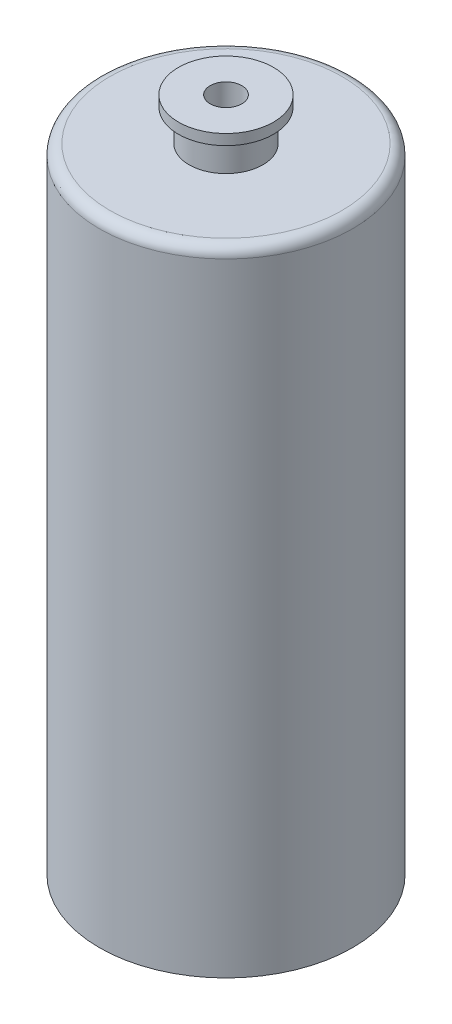
ISO-10303-21;
HEADER;
FILE_DESCRIPTION(('STEP AP214'),'2;1');
FILE_NAME('part.step','',(''),(''),'','','');
FILE_SCHEMA(('AUTOMOTIVE_DESIGN { 1 0 10303 214 1 1 1 1 }'));
ENDSEC;
DATA;
#1=APPLICATION_CONTEXT('core data for automotive mechanical design processes');
#2=APPLICATION_PROTOCOL_DEFINITION('international standard','automotive_design',2000,#1);
#3=PRODUCT_CONTEXT('',#1,'mechanical');
#4=PRODUCT('Part','Part','',(#3));
#5=PRODUCT_RELATED_PRODUCT_CATEGORY('part','',(#4));
#6=PRODUCT_DEFINITION_FORMATION('','',#4);
#7=PRODUCT_DEFINITION_CONTEXT('part definition',#1,'design');
#8=PRODUCT_DEFINITION('design','',#6,#7);
#9=PRODUCT_DEFINITION_SHAPE('','',#8);
#10=(LENGTH_UNIT() NAMED_UNIT(*) SI_UNIT(.MILLI.,.METRE.));
#11=(NAMED_UNIT(*) PLANE_ANGLE_UNIT() SI_UNIT($,.RADIAN.));
#12=(NAMED_UNIT(*) SI_UNIT($,.STERADIAN.) SOLID_ANGLE_UNIT());
#13=UNCERTAINTY_MEASURE_WITH_UNIT(LENGTH_MEASURE(1.E-05),#10,'distance_accuracy_value','');
#14=(GEOMETRIC_REPRESENTATION_CONTEXT(3) GLOBAL_UNCERTAINTY_ASSIGNED_CONTEXT((#13)) GLOBAL_UNIT_ASSIGNED_CONTEXT((#10,
#11,#12)) REPRESENTATION_CONTEXT('',''));
#15=CARTESIAN_POINT('',(0.,0.,0.));
#16=DIRECTION('',(0.,0.,1.));
#17=DIRECTION('',(1.,0.,0.));
#18=AXIS2_PLACEMENT_3D('',#15,#16,#17);
#19=CARTESIAN_POINT('',(0.,381.,0.));
#20=DIRECTION('',(0.,1.,0.));
#21=DIRECTION('',(0.,0.,1.));
#22=AXIS2_PLACEMENT_3D('',#19,#20,#21);
#23=PLANE('',#22);
#24=CARTESIAN_POINT('',(0.,381.,0.));
#25=DIRECTION('',(0.,1.,0.));
#26=DIRECTION('',(0.,0.,1.));
#27=AXIS2_PLACEMENT_3D('',#24,#25,#26);
#28=CIRCLE('',#27,69.85);
#29=CARTESIAN_POINT('',(0.,381.,69.85));
#30=VERTEX_POINT('',#29);
#31=EDGE_CURVE('E54',#30,#30,#28,.T.);
#32=ORIENTED_EDGE('',*,*,#31,.T.);
#33=EDGE_LOOP('',(#32));
#34=FACE_BOUND('',#33,.T.);
#35=CARTESIAN_POINT('',(-1.30692486857548E-12,381.,0.));
#36=DIRECTION('',(0.,-1.,0.));
#37=DIRECTION('',(1.,0.,0.));
#38=AXIS2_PLACEMENT_3D('',#35,#36,#37);
#39=CIRCLE('',#38,22.2249999999987);
#40=CARTESIAN_POINT('',(22.2249999999974,381.,0.));
#41=VERTEX_POINT('',#40);
#42=EDGE_CURVE('E60',#41,#41,#39,.T.);
#43=ORIENTED_EDGE('',*,*,#42,.T.);
#44=EDGE_LOOP('',(#43));
#45=FACE_BOUND('',#44,.T.);
#46=ADVANCED_FACE('F39',(#34,#45),#23,.T.);
#47=CARTESIAN_POINT('',(0.,381.,0.));
#48=DIRECTION('',(0.,-1.,0.));
#49=DIRECTION('',(0.,0.,-1.));
#50=AXIS2_PLACEMENT_3D('',#47,#48,#49);
#51=CYLINDRICAL_SURFACE('',#50,76.2);
#52=CARTESIAN_POINT('',(0.,374.65,0.));
#53=DIRECTION('',(0.,1.,0.));
#54=DIRECTION('',(0.,0.,1.));
#55=AXIS2_PLACEMENT_3D('',#52,#53,#54);
#56=CIRCLE('',#55,76.2);
#57=CARTESIAN_POINT('',(0.,374.65,76.2));
#58=VERTEX_POINT('',#57);
#59=EDGE_CURVE('E50',#58,#58,#56,.F.);
#60=ORIENTED_EDGE('',*,*,#59,.T.);
#61=EDGE_LOOP('',(#60));
#62=FACE_BOUND('',#61,.T.);
#63=CARTESIAN_POINT('',(0.,0.,0.));
#64=DIRECTION('',(0.,1.,0.));
#65=DIRECTION('',(0.,0.,1.));
#66=AXIS2_PLACEMENT_3D('',#63,#64,#65);
#67=CIRCLE('',#66,76.2);
#68=CARTESIAN_POINT('',(0.,0.,76.2));
#69=VERTEX_POINT('',#68);
#70=EDGE_CURVE('E57',#69,#69,#67,.T.);
#71=ORIENTED_EDGE('',*,*,#70,.T.);
#72=EDGE_LOOP('',(#71));
#73=FACE_BOUND('',#72,.T.);
#74=ADVANCED_FACE('F90',(#62,#73),#51,.T.);
#75=CARTESIAN_POINT('',(0.,0.,0.));
#76=DIRECTION('',(0.,1.,0.));
#77=DIRECTION('',(0.,0.,1.));
#78=AXIS2_PLACEMENT_3D('',#75,#76,#77);
#79=PLANE('',#78);
#80=ORIENTED_EDGE('',*,*,#70,.F.);
#81=EDGE_LOOP('',(#80));
#82=FACE_BOUND('',#81,.T.);
#83=ADVANCED_FACE('F96',(#82),#79,.F.);
#84=CARTESIAN_POINT('',(0.,374.65,0.));
#85=DIRECTION('',(0.,1.,0.));
#86=DIRECTION('',(0.,0.,1.));
#87=AXIS2_PLACEMENT_3D('',#84,#85,#86);
#88=TOROIDAL_SURFACE('',#87,69.85,6.35);
#89=ORIENTED_EDGE('',*,*,#59,.F.);
#90=EDGE_LOOP('',(#89));
#91=FACE_BOUND('',#90,.T.);
#92=ORIENTED_EDGE('',*,*,#31,.F.);
#93=EDGE_LOOP('',(#92));
#94=FACE_BOUND('',#93,.T.);
#95=ADVANCED_FACE('F105',(#91,#94),#88,.T.);
#96=CARTESIAN_POINT('',(3.43024899888577E-12,-1000.,0.));
#97=DIRECTION('',(0.,-1.,0.));
#98=DIRECTION('',(1.,0.,0.));
#99=AXIS2_PLACEMENT_3D('',#96,#97,#98);
#100=CYLINDRICAL_SURFACE('',#99,22.2249999999987);
#101=ORIENTED_EDGE('',*,*,#42,.F.);
#102=EDGE_LOOP('',(#101));
#103=FACE_BOUND('',#102,.T.);
#104=CARTESIAN_POINT('',(-1.37227111200425E-12,400.05,0.));
#105=DIRECTION('',(0.,-1.,0.));
#106=DIRECTION('',(1.,0.,0.));
#107=AXIS2_PLACEMENT_3D('',#104,#105,#106);
#108=CIRCLE('',#107,22.2249999999986);
#109=CARTESIAN_POINT('',(22.2249999999973,400.05,0.));
#110=VERTEX_POINT('',#109);
#111=EDGE_CURVE('E63',#110,#110,#108,.T.);
#112=ORIENTED_EDGE('',*,*,#111,.T.);
#113=EDGE_LOOP('',(#112));
#114=FACE_BOUND('',#113,.T.);
#115=ADVANCED_FACE('F102',(#103,#114),#100,.T.);
#116=CARTESIAN_POINT('',(-28.575,400.05,0.));
#117=DIRECTION('',(0.,1.,0.));
#118=DIRECTION('',(-1.,0.,0.));
#119=AXIS2_PLACEMENT_3D('',#116,#117,#118);
#120=PLANE('',#119);
#121=ORIENTED_EDGE('',*,*,#111,.F.);
#122=EDGE_LOOP('',(#121));
#123=FACE_BOUND('',#122,.T.);
#124=CARTESIAN_POINT('',(-1.37227111200425E-12,400.05,0.));
#125=DIRECTION('',(0.,-1.,0.));
#126=DIRECTION('',(1.,0.,0.));
#127=AXIS2_PLACEMENT_3D('',#124,#125,#126);
#128=CIRCLE('',#127,28.5749999999986);
#129=CARTESIAN_POINT('',(28.5749999999973,400.05,0.));
#130=VERTEX_POINT('',#129);
#131=EDGE_CURVE('E66',#130,#130,#128,.T.);
#132=ORIENTED_EDGE('',*,*,#131,.T.);
#133=EDGE_LOOP('',(#132));
#134=FACE_BOUND('',#133,.T.);
#135=ADVANCED_FACE('F129',(#123,#134),#120,.F.);
#136=CARTESIAN_POINT('',(3.43024899888577E-12,-1000.,0.));
#137=DIRECTION('',(0.,-1.,0.));
#138=DIRECTION('',(1.,0.,0.));
#139=AXIS2_PLACEMENT_3D('',#136,#137,#138);
#140=CYLINDRICAL_SURFACE('',#139,28.5749999999986);
#141=ORIENTED_EDGE('',*,*,#131,.F.);
#142=EDGE_LOOP('',(#141));
#143=FACE_BOUND('',#142,.T.);
#144=CARTESIAN_POINT('',(-1.39405319314718E-12,406.4,0.));
#145=DIRECTION('',(0.,-1.,0.));
#146=DIRECTION('',(1.,0.,0.));
#147=AXIS2_PLACEMENT_3D('',#144,#145,#146);
#148=CIRCLE('',#147,28.5749999999986);
#149=CARTESIAN_POINT('',(28.5749999999972,406.4,0.));
#150=VERTEX_POINT('',#149);
#151=EDGE_CURVE('E69',#150,#150,#148,.T.);
#152=ORIENTED_EDGE('',*,*,#151,.T.);
#153=EDGE_LOOP('',(#152));
#154=FACE_BOUND('',#153,.T.);
#155=ADVANCED_FACE('F123',(#143,#154),#140,.T.);
#156=CARTESIAN_POINT('',(-9.525,406.4,0.));
#157=DIRECTION('',(0.,-1.,0.));
#158=DIRECTION('',(1.,0.,0.));
#159=AXIS2_PLACEMENT_3D('',#156,#157,#158);
#160=PLANE('',#159);
#161=ORIENTED_EDGE('',*,*,#151,.F.);
#162=EDGE_LOOP('',(#161));
#163=FACE_BOUND('',#162,.T.);
#164=CARTESIAN_POINT('',(-1.39405319314718E-12,406.4,0.));
#165=DIRECTION('',(0.,-1.,0.));
#166=DIRECTION('',(1.,0.,0.));
#167=AXIS2_PLACEMENT_3D('',#164,#165,#166);
#168=CIRCLE('',#167,9.52499999999861);
#169=CARTESIAN_POINT('',(9.52499999999721,406.4,0.));
#170=VERTEX_POINT('',#169);
#171=EDGE_CURVE('E72',#170,#170,#168,.T.);
#172=ORIENTED_EDGE('',*,*,#171,.T.);
#173=EDGE_LOOP('',(#172));
#174=FACE_BOUND('',#173,.T.);
#175=ADVANCED_FACE('F115',(#163,#174),#160,.F.);
#176=CARTESIAN_POINT('',(3.43024899888577E-12,-1000.,0.));
#177=DIRECTION('',(0.,-1.,0.));
#178=DIRECTION('',(1.,0.,0.));
#179=AXIS2_PLACEMENT_3D('',#176,#177,#178);
#180=CYLINDRICAL_SURFACE('',#179,9.52499999999865);
#181=ORIENTED_EDGE('',*,*,#171,.F.);
#182=EDGE_LOOP('',(#181));
#183=FACE_BOUND('',#182,.T.);
#184=CARTESIAN_POINT('',(0.,360.68,0.));
#185=DIRECTION('',(0.,1.,0.));
#186=DIRECTION('',(0.,0.,1.));
#187=AXIS2_PLACEMENT_3D('',#184,#185,#186);
#188=CIRCLE('',#187,9.52499999999777);
#189=CARTESIAN_POINT('',(0.,360.68,9.52499999999777));
#190=VERTEX_POINT('',#189);
#191=EDGE_CURVE('E75',#190,#190,#188,.F.);
#192=ORIENTED_EDGE('',*,*,#191,.T.);
#193=EDGE_LOOP('',(#192));
#194=FACE_BOUND('',#193,.T.);
#195=ADVANCED_FACE('F79',(#183,#194),#180,.F.);
#196=CARTESIAN_POINT('',(0.,381.,0.));
#197=DIRECTION('',(0.,-1.,0.));
#198=DIRECTION('',(0.,0.,-1.));
#199=AXIS2_PLACEMENT_3D('',#196,#197,#198);
#200=CYLINDRICAL_SURFACE('',#199,55.88);
#201=CARTESIAN_POINT('',(0.,360.68,0.));
#202=DIRECTION('',(0.,1.,0.));
#203=DIRECTION('',(0.,0.,1.));
#204=AXIS2_PLACEMENT_3D('',#201,#202,#203);
#205=CIRCLE('',#204,55.88);
#206=CARTESIAN_POINT('',(0.,360.68,55.88));
#207=VERTEX_POINT('',#206);
#208=EDGE_CURVE('E10',#207,#207,#205,.T.);
#209=ORIENTED_EDGE('',*,*,#208,.T.);
#210=EDGE_LOOP('',(#209));
#211=FACE_BOUND('',#210,.T.);
#212=CARTESIAN_POINT('',(0.,25.4,0.));
#213=DIRECTION('',(0.,1.,0.));
#214=DIRECTION('',(0.,0.,1.));
#215=AXIS2_PLACEMENT_3D('',#212,#213,#214);
#216=CIRCLE('',#215,55.88);
#217=CARTESIAN_POINT('',(0.,25.4,55.88));
#218=VERTEX_POINT('',#217);
#219=EDGE_CURVE('E43',#218,#218,#216,.T.);
#220=ORIENTED_EDGE('',*,*,#219,.F.);
#221=EDGE_LOOP('',(#220));
#222=FACE_BOUND('',#221,.T.);
#223=ADVANCED_FACE('F87',(#211,#222),#200,.F.);
#224=CARTESIAN_POINT('',(0.,25.4,0.));
#225=DIRECTION('',(0.,1.,0.));
#226=DIRECTION('',(0.,0.,1.));
#227=AXIS2_PLACEMENT_3D('',#224,#225,#226);
#228=PLANE('',#227);
#229=ORIENTED_EDGE('',*,*,#219,.T.);
#230=EDGE_LOOP('',(#229));
#231=FACE_BOUND('',#230,.T.);
#232=ADVANCED_FACE('F83',(#231),#228,.T.);
#233=CARTESIAN_POINT('',(0.,360.68,0.));
#234=DIRECTION('',(0.,1.,0.));
#235=DIRECTION('',(0.,0.,1.));
#236=AXIS2_PLACEMENT_3D('',#233,#234,#235);
#237=PLANE('',#236);
#238=ORIENTED_EDGE('',*,*,#191,.F.);
#239=EDGE_LOOP('',(#238));
#240=FACE_BOUND('',#239,.T.);
#241=ORIENTED_EDGE('',*,*,#208,.F.);
#242=EDGE_LOOP('',(#241));
#243=FACE_BOUND('',#242,.T.);
#244=ADVANCED_FACE('F41',(#240,#243),#237,.F.);
#245=CLOSED_SHELL('',(#46,#74,#83,#95,#115,#135,#155,#175,#195,#223,#232,#244));
#246=MANIFOLD_SOLID_BREP('B2',#245);
#247=ADVANCED_BREP_SHAPE_REPRESENTATION('',(#18,#246),#14);
#248=SHAPE_DEFINITION_REPRESENTATION(#9,#247);
ENDSEC;
END-ISO-10303-21;
